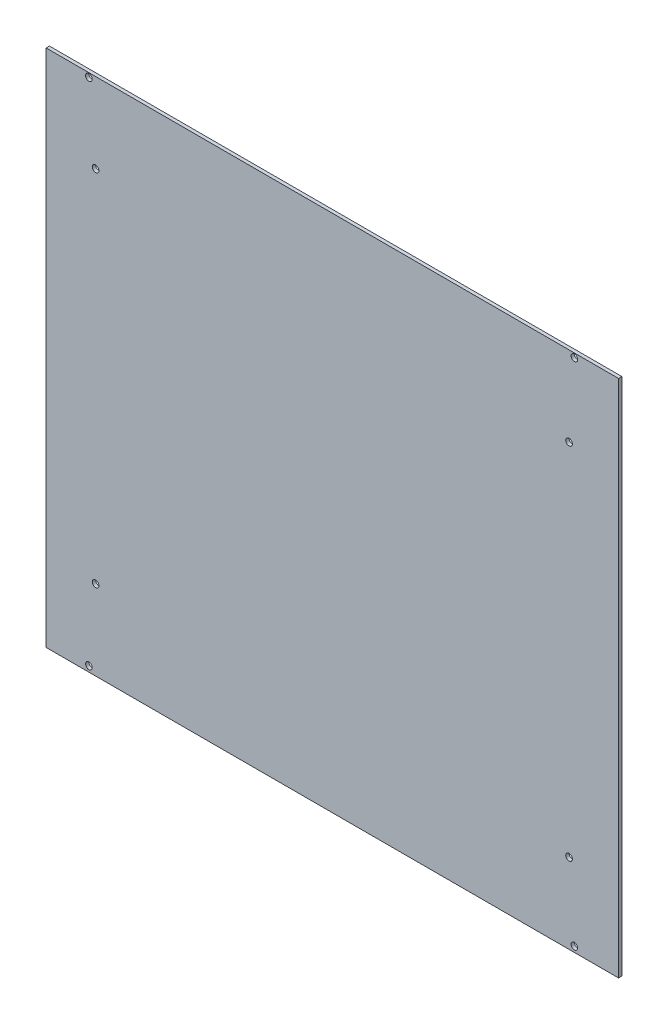
ISO-10303-21;
HEADER;
FILE_DESCRIPTION(('STEP AP214'),'2;1');
FILE_NAME('part.step','',(''),(''),'','','');
FILE_SCHEMA(('AUTOMOTIVE_DESIGN { 1 0 10303 214 1 1 1 1 }'));
ENDSEC;
DATA;
#1=APPLICATION_CONTEXT('core data for automotive mechanical design processes');
#2=APPLICATION_PROTOCOL_DEFINITION('international standard','automotive_design',2000,#1);
#3=PRODUCT_CONTEXT('',#1,'mechanical');
#4=PRODUCT('Part','Part','',(#3));
#5=PRODUCT_RELATED_PRODUCT_CATEGORY('part','',(#4));
#6=PRODUCT_DEFINITION_FORMATION('','',#4);
#7=PRODUCT_DEFINITION_CONTEXT('part definition',#1,'design');
#8=PRODUCT_DEFINITION('design','',#6,#7);
#9=PRODUCT_DEFINITION_SHAPE('','',#8);
#10=(LENGTH_UNIT() NAMED_UNIT(*) SI_UNIT(.MILLI.,.METRE.));
#11=(NAMED_UNIT(*) PLANE_ANGLE_UNIT() SI_UNIT($,.RADIAN.));
#12=(NAMED_UNIT(*) SI_UNIT($,.STERADIAN.) SOLID_ANGLE_UNIT());
#13=UNCERTAINTY_MEASURE_WITH_UNIT(LENGTH_MEASURE(1.E-05),#10,'distance_accuracy_value','');
#14=(GEOMETRIC_REPRESENTATION_CONTEXT(3) GLOBAL_UNCERTAINTY_ASSIGNED_CONTEXT((#13)) GLOBAL_UNIT_ASSIGNED_CONTEXT((#10,
#11,#12)) REPRESENTATION_CONTEXT('',''));
#15=CARTESIAN_POINT('',(0.,0.,0.));
#16=DIRECTION('',(0.,0.,1.));
#17=DIRECTION('',(1.,0.,0.));
#18=AXIS2_PLACEMENT_3D('',#15,#16,#17);
#19=CARTESIAN_POINT('',(0.,0.,3.175));
#20=DIRECTION('',(0.,0.,1.));
#21=DIRECTION('',(1.,0.,0.));
#22=AXIS2_PLACEMENT_3D('',#19,#20,#21);
#23=PLANE('',#22);
#24=CARTESIAN_POINT('',(230.894832537542,243.724649044321,3.175));
#25=DIRECTION('',(0.,0.,1.));
#26=DIRECTION('',(1.,0.,0.));
#27=AXIS2_PLACEMENT_3D('',#24,#25,#26);
#28=CIRCLE('',#27,3.175);
#29=CARTESIAN_POINT('',(234.069832537542,243.724649044321,3.175));
#30=VERTEX_POINT('',#29);
#31=EDGE_CURVE('E214',#30,#30,#28,.T.);
#32=ORIENTED_EDGE('',*,*,#31,.F.);
#33=EDGE_LOOP('',(#32));
#34=FACE_BOUND('',#33,.T.);
#35=CARTESIAN_POINT('',(-232.208873439651,-242.410608142211,3.175));
#36=DIRECTION('',(0.,0.,1.));
#37=DIRECTION('',(1.,0.,0.));
#38=AXIS2_PLACEMENT_3D('',#35,#36,#37);
#39=CIRCLE('',#38,3.175);
#40=CARTESIAN_POINT('',(-229.033873439651,-242.410608142211,3.175));
#41=VERTEX_POINT('',#40);
#42=EDGE_CURVE('E210',#41,#41,#39,.T.);
#43=ORIENTED_EDGE('',*,*,#42,.F.);
#44=EDGE_LOOP('',(#43));
#45=FACE_BOUND('',#44,.T.);
#46=CARTESIAN_POINT('',(-232.208873439651,243.724649044321,3.175));
#47=DIRECTION('',(0.,0.,1.));
#48=DIRECTION('',(1.,0.,0.));
#49=AXIS2_PLACEMENT_3D('',#46,#47,#48);
#50=CIRCLE('',#49,3.175);
#51=CARTESIAN_POINT('',(-229.033873439651,243.724649044321,3.175));
#52=VERTEX_POINT('',#51);
#53=EDGE_CURVE('E184',#52,#52,#50,.T.);
#54=ORIENTED_EDGE('',*,*,#53,.F.);
#55=EDGE_LOOP('',(#54));
#56=FACE_BOUND('',#55,.T.);
#57=CARTESIAN_POINT('',(230.894832537542,-242.410608142211,3.175));
#58=DIRECTION('',(0.,0.,1.));
#59=DIRECTION('',(1.,0.,0.));
#60=AXIS2_PLACEMENT_3D('',#57,#58,#59);
#61=CIRCLE('',#60,3.175);
#62=CARTESIAN_POINT('',(234.069832537542,-242.410608142211,3.175));
#63=VERTEX_POINT('',#62);
#64=EDGE_CURVE('E204',#63,#63,#61,.T.);
#65=ORIENTED_EDGE('',*,*,#64,.F.);
#66=EDGE_LOOP('',(#65));
#67=FACE_BOUND('',#66,.T.);
#68=CARTESIAN_POINT('',(-225.806,-171.45,3.175));
#69=DIRECTION('',(0.,0.,-1.));
#70=DIRECTION('',(-1.,0.,0.));
#71=AXIS2_PLACEMENT_3D('',#68,#69,#70);
#72=CIRCLE('',#71,3.175);
#73=CARTESIAN_POINT('',(-228.981,-171.45,3.175));
#74=VERTEX_POINT('',#73);
#75=EDGE_CURVE('E236',#74,#74,#72,.T.);
#76=ORIENTED_EDGE('',*,*,#75,.T.);
#77=EDGE_LOOP('',(#76));
#78=FACE_BOUND('',#77,.T.);
#79=CARTESIAN_POINT('',(225.806,-171.45,3.175));
#80=DIRECTION('',(0.,0.,1.));
#81=DIRECTION('',(1.,0.,0.));
#82=AXIS2_PLACEMENT_3D('',#79,#80,#81);
#83=CIRCLE('',#82,3.175);
#84=CARTESIAN_POINT('',(228.981,-171.45,3.175));
#85=VERTEX_POINT('',#84);
#86=EDGE_CURVE('E219',#85,#85,#83,.T.);
#87=ORIENTED_EDGE('',*,*,#86,.F.);
#88=EDGE_LOOP('',(#87));
#89=FACE_BOUND('',#88,.T.);
#90=CARTESIAN_POINT('',(-225.806,171.45,3.175));
#91=DIRECTION('',(0.,0.,1.));
#92=DIRECTION('',(1.,0.,0.));
#93=AXIS2_PLACEMENT_3D('',#90,#91,#92);
#94=CIRCLE('',#93,3.175);
#95=CARTESIAN_POINT('',(-222.631,171.45,3.175));
#96=VERTEX_POINT('',#95);
#97=EDGE_CURVE('E231',#96,#96,#94,.T.);
#98=ORIENTED_EDGE('',*,*,#97,.F.);
#99=EDGE_LOOP('',(#98));
#100=FACE_BOUND('',#99,.T.);
#101=DIRECTION('',(1.,0.,0.));
#102=VECTOR('',#101,1.);
#103=CARTESIAN_POINT('',(-273.05,247.65,3.175));
#104=LINE('',#103,#102);
#105=CARTESIAN_POINT('',(-273.05,247.65,3.175));
#106=VERTEX_POINT('',#105);
#107=CARTESIAN_POINT('',(273.05,247.65,3.175));
#108=VERTEX_POINT('',#107);
#109=EDGE_CURVE('E102',#106,#108,#104,.T.);
#110=ORIENTED_EDGE('',*,*,#109,.F.);
#111=DIRECTION('',(0.,1.,0.));
#112=VECTOR('',#111,1.);
#113=CARTESIAN_POINT('',(-273.05,-247.65,3.175));
#114=LINE('',#113,#112);
#115=CARTESIAN_POINT('',(-273.05,-247.65,3.175));
#116=VERTEX_POINT('',#115);
#117=EDGE_CURVE('E89',#116,#106,#114,.T.);
#118=ORIENTED_EDGE('',*,*,#117,.F.);
#119=DIRECTION('',(1.,0.,0.));
#120=VECTOR('',#119,1.);
#121=CARTESIAN_POINT('',(-273.05,-247.65,3.175));
#122=LINE('',#121,#120);
#123=CARTESIAN_POINT('',(273.05,-247.65,3.175));
#124=VERTEX_POINT('',#123);
#125=EDGE_CURVE('E86',#116,#124,#122,.T.);
#126=ORIENTED_EDGE('',*,*,#125,.T.);
#127=DIRECTION('',(0.,1.,0.));
#128=VECTOR('',#127,1.);
#129=CARTESIAN_POINT('',(273.05,-247.65,3.175));
#130=LINE('',#129,#128);
#131=EDGE_CURVE('E83',#124,#108,#130,.T.);
#132=ORIENTED_EDGE('',*,*,#131,.T.);
#133=EDGE_LOOP('',(#110,#118,#126,#132));
#134=FACE_BOUND('',#133,.T.);
#135=CARTESIAN_POINT('',(225.806,171.45,3.175));
#136=DIRECTION('',(0.,0.,-1.));
#137=DIRECTION('',(-1.,0.,0.));
#138=AXIS2_PLACEMENT_3D('',#135,#136,#137);
#139=CIRCLE('',#138,3.175);
#140=CARTESIAN_POINT('',(222.631,171.45,3.175));
#141=VERTEX_POINT('',#140);
#142=EDGE_CURVE('E227',#141,#141,#139,.T.);
#143=ORIENTED_EDGE('',*,*,#142,.T.);
#144=EDGE_LOOP('',(#143));
#145=FACE_BOUND('',#144,.T.);
#146=ADVANCED_FACE('F39',(#34,#45,#56,#67,#78,#89,#100,#134,#145),#23,.T.);
#147=CARTESIAN_POINT('',(0.,0.,0.));
#148=DIRECTION('',(0.,0.,1.));
#149=DIRECTION('',(1.,0.,0.));
#150=AXIS2_PLACEMENT_3D('',#147,#148,#149);
#151=PLANE('',#150);
#152=CARTESIAN_POINT('',(230.894832537542,243.724649044321,0.));
#153=DIRECTION('',(0.,0.,-1.));
#154=DIRECTION('',(1.,0.,0.));
#155=AXIS2_PLACEMENT_3D('',#152,#153,#154);
#156=CIRCLE('',#155,3.175);
#157=CARTESIAN_POINT('',(234.069832537542,243.724649044321,0.));
#158=VERTEX_POINT('',#157);
#159=EDGE_CURVE('E194',#158,#158,#156,.T.);
#160=ORIENTED_EDGE('',*,*,#159,.F.);
#161=EDGE_LOOP('',(#160));
#162=FACE_BOUND('',#161,.T.);
#163=CARTESIAN_POINT('',(-232.208873439651,-242.410608142211,0.));
#164=DIRECTION('',(0.,0.,-1.));
#165=DIRECTION('',(1.,0.,0.));
#166=AXIS2_PLACEMENT_3D('',#163,#164,#165);
#167=CIRCLE('',#166,3.175);
#168=CARTESIAN_POINT('',(-229.033873439651,-242.410608142211,0.));
#169=VERTEX_POINT('',#168);
#170=EDGE_CURVE('E190',#169,#169,#167,.T.);
#171=ORIENTED_EDGE('',*,*,#170,.F.);
#172=EDGE_LOOP('',(#171));
#173=FACE_BOUND('',#172,.T.);
#174=CARTESIAN_POINT('',(-232.208873439651,243.724649044321,0.));
#175=DIRECTION('',(0.,0.,-1.));
#176=DIRECTION('',(-1.,0.,0.));
#177=AXIS2_PLACEMENT_3D('',#174,#175,#176);
#178=CIRCLE('',#177,3.175);
#179=CARTESIAN_POINT('',(-235.383873439651,243.724649044321,0.));
#180=VERTEX_POINT('',#179);
#181=EDGE_CURVE('E187',#180,#180,#178,.T.);
#182=ORIENTED_EDGE('',*,*,#181,.F.);
#183=EDGE_LOOP('',(#182));
#184=FACE_BOUND('',#183,.T.);
#185=CARTESIAN_POINT('',(230.894832537542,-242.410608142211,0.));
#186=DIRECTION('',(0.,0.,-1.));
#187=DIRECTION('',(-1.,0.,0.));
#188=AXIS2_PLACEMENT_3D('',#185,#186,#187);
#189=CIRCLE('',#188,3.175);
#190=CARTESIAN_POINT('',(227.719832537542,-242.410608142211,0.));
#191=VERTEX_POINT('',#190);
#192=EDGE_CURVE('E199',#191,#191,#189,.T.);
#193=ORIENTED_EDGE('',*,*,#192,.F.);
#194=EDGE_LOOP('',(#193));
#195=FACE_BOUND('',#194,.T.);
#196=CARTESIAN_POINT('',(225.806,-171.45,0.));
#197=DIRECTION('',(0.,0.,1.));
#198=DIRECTION('',(1.,0.,0.));
#199=AXIS2_PLACEMENT_3D('',#196,#197,#198);
#200=CIRCLE('',#199,3.175);
#201=CARTESIAN_POINT('',(228.981,-171.45,0.));
#202=VERTEX_POINT('',#201);
#203=EDGE_CURVE('E218',#202,#202,#200,.T.);
#204=ORIENTED_EDGE('',*,*,#203,.T.);
#205=EDGE_LOOP('',(#204));
#206=FACE_BOUND('',#205,.T.);
#207=CARTESIAN_POINT('',(-225.806,171.45,0.));
#208=DIRECTION('',(0.,0.,1.));
#209=DIRECTION('',(1.,0.,0.));
#210=AXIS2_PLACEMENT_3D('',#207,#208,#209);
#211=CIRCLE('',#210,3.175);
#212=CARTESIAN_POINT('',(-222.631,171.45,0.));
#213=VERTEX_POINT('',#212);
#214=EDGE_CURVE('E116',#213,#213,#211,.T.);
#215=ORIENTED_EDGE('',*,*,#214,.T.);
#216=EDGE_LOOP('',(#215));
#217=FACE_BOUND('',#216,.T.);
#218=DIRECTION('',(1.,0.,0.));
#219=VECTOR('',#218,1.);
#220=CARTESIAN_POINT('',(-273.05,247.65,0.));
#221=LINE('',#220,#219);
#222=CARTESIAN_POINT('',(-273.05,247.65,0.));
#223=VERTEX_POINT('',#222);
#224=CARTESIAN_POINT('',(273.05,247.65,0.));
#225=VERTEX_POINT('',#224);
#226=EDGE_CURVE('E111',#223,#225,#221,.T.);
#227=ORIENTED_EDGE('',*,*,#226,.T.);
#228=DIRECTION('',(0.,1.,0.));
#229=VECTOR('',#228,1.);
#230=CARTESIAN_POINT('',(273.05,-247.65,0.));
#231=LINE('',#230,#229);
#232=CARTESIAN_POINT('',(273.05,-247.65,0.));
#233=VERTEX_POINT('',#232);
#234=EDGE_CURVE('E115',#233,#225,#231,.T.);
#235=ORIENTED_EDGE('',*,*,#234,.F.);
#236=DIRECTION('',(1.,0.,0.));
#237=VECTOR('',#236,1.);
#238=CARTESIAN_POINT('',(-273.05,-247.65,0.));
#239=LINE('',#238,#237);
#240=CARTESIAN_POINT('',(-273.05,-247.65,0.));
#241=VERTEX_POINT('',#240);
#242=EDGE_CURVE('E95',#241,#233,#239,.T.);
#243=ORIENTED_EDGE('',*,*,#242,.F.);
#244=DIRECTION('',(0.,1.,0.));
#245=VECTOR('',#244,1.);
#246=CARTESIAN_POINT('',(-273.05,-247.65,0.));
#247=LINE('',#246,#245);
#248=EDGE_CURVE('E105',#241,#223,#247,.T.);
#249=ORIENTED_EDGE('',*,*,#248,.T.);
#250=EDGE_LOOP('',(#227,#235,#243,#249));
#251=FACE_BOUND('',#250,.T.);
#252=CARTESIAN_POINT('',(-225.806,-171.45,0.));
#253=DIRECTION('',(0.,0.,-1.));
#254=DIRECTION('',(-1.,0.,0.));
#255=AXIS2_PLACEMENT_3D('',#252,#253,#254);
#256=CIRCLE('',#255,3.175);
#257=CARTESIAN_POINT('',(-228.981,-171.45,0.));
#258=VERTEX_POINT('',#257);
#259=EDGE_CURVE('E223',#258,#258,#256,.T.);
#260=ORIENTED_EDGE('',*,*,#259,.F.);
#261=EDGE_LOOP('',(#260));
#262=FACE_BOUND('',#261,.T.);
#263=CARTESIAN_POINT('',(225.806,171.45,0.));
#264=DIRECTION('',(0.,0.,-1.));
#265=DIRECTION('',(-1.,0.,0.));
#266=AXIS2_PLACEMENT_3D('',#263,#264,#265);
#267=CIRCLE('',#266,3.175);
#268=CARTESIAN_POINT('',(222.631,171.45,0.));
#269=VERTEX_POINT('',#268);
#270=EDGE_CURVE('E232',#269,#269,#267,.T.);
#271=ORIENTED_EDGE('',*,*,#270,.F.);
#272=EDGE_LOOP('',(#271));
#273=FACE_BOUND('',#272,.T.);
#274=ADVANCED_FACE('F127',(#162,#173,#184,#195,#206,#217,#251,#262,#273),#151,.F.);
#275=CARTESIAN_POINT('',(-273.05,247.65,3.175));
#276=DIRECTION('',(0.,1.,0.));
#277=DIRECTION('',(0.,0.,1.));
#278=AXIS2_PLACEMENT_3D('',#275,#276,#277);
#279=PLANE('',#278);
#280=ORIENTED_EDGE('',*,*,#226,.F.);
#281=DIRECTION('',(0.,0.,-1.));
#282=VECTOR('',#281,1.);
#283=CARTESIAN_POINT('',(-273.05,247.65,3.175));
#284=LINE('',#283,#282);
#285=EDGE_CURVE('E11',#106,#223,#284,.T.);
#286=ORIENTED_EDGE('',*,*,#285,.F.);
#287=ORIENTED_EDGE('',*,*,#109,.T.);
#288=DIRECTION('',(0.,0.,-1.));
#289=VECTOR('',#288,1.);
#290=CARTESIAN_POINT('',(273.05,247.65,3.175));
#291=LINE('',#290,#289);
#292=EDGE_CURVE('E43',#108,#225,#291,.T.);
#293=ORIENTED_EDGE('',*,*,#292,.T.);
#294=EDGE_LOOP('',(#280,#286,#287,#293));
#295=FACE_BOUND('',#294,.T.);
#296=ADVANCED_FACE('F41',(#295),#279,.T.);
#297=CARTESIAN_POINT('',(-273.05,-247.65,3.175));
#298=DIRECTION('',(-1.,0.,0.));
#299=DIRECTION('',(0.,0.,1.));
#300=AXIS2_PLACEMENT_3D('',#297,#298,#299);
#301=PLANE('',#300);
#302=ORIENTED_EDGE('',*,*,#248,.F.);
#303=DIRECTION('',(0.,0.,-1.));
#304=VECTOR('',#303,1.);
#305=CARTESIAN_POINT('',(-273.05,-247.65,3.175));
#306=LINE('',#305,#304);
#307=EDGE_CURVE('E50',#116,#241,#306,.T.);
#308=ORIENTED_EDGE('',*,*,#307,.F.);
#309=ORIENTED_EDGE('',*,*,#117,.T.);
#310=ORIENTED_EDGE('',*,*,#285,.T.);
#311=EDGE_LOOP('',(#302,#308,#309,#310));
#312=FACE_BOUND('',#311,.T.);
#313=ADVANCED_FACE('F129',(#312),#301,.T.);
#314=CARTESIAN_POINT('',(-273.05,-247.65,3.175));
#315=DIRECTION('',(0.,1.,0.));
#316=DIRECTION('',(0.,0.,1.));
#317=AXIS2_PLACEMENT_3D('',#314,#315,#316);
#318=PLANE('',#317);
#319=ORIENTED_EDGE('',*,*,#242,.T.);
#320=DIRECTION('',(0.,0.,-1.));
#321=VECTOR('',#320,1.);
#322=CARTESIAN_POINT('',(273.05,-247.65,3.175));
#323=LINE('',#322,#321);
#324=EDGE_CURVE('E93',#124,#233,#323,.T.);
#325=ORIENTED_EDGE('',*,*,#324,.F.);
#326=ORIENTED_EDGE('',*,*,#125,.F.);
#327=ORIENTED_EDGE('',*,*,#307,.T.);
#328=EDGE_LOOP('',(#319,#325,#326,#327));
#329=FACE_BOUND('',#328,.T.);
#330=ADVANCED_FACE('F94',(#329),#318,.F.);
#331=CARTESIAN_POINT('',(273.05,-247.65,3.175));
#332=DIRECTION('',(-1.,0.,0.));
#333=DIRECTION('',(0.,0.,1.));
#334=AXIS2_PLACEMENT_3D('',#331,#332,#333);
#335=PLANE('',#334);
#336=ORIENTED_EDGE('',*,*,#234,.T.);
#337=ORIENTED_EDGE('',*,*,#292,.F.);
#338=ORIENTED_EDGE('',*,*,#131,.F.);
#339=ORIENTED_EDGE('',*,*,#324,.T.);
#340=EDGE_LOOP('',(#336,#337,#338,#339));
#341=FACE_BOUND('',#340,.T.);
#342=ADVANCED_FACE('F100',(#341),#335,.F.);
#343=CARTESIAN_POINT('',(-225.806,171.45,0.));
#344=DIRECTION('',(0.,0.,1.));
#345=DIRECTION('',(1.,0.,0.));
#346=AXIS2_PLACEMENT_3D('',#343,#344,#345);
#347=CYLINDRICAL_SURFACE('',#346,3.175);
#348=ORIENTED_EDGE('',*,*,#214,.F.);
#349=EDGE_LOOP('',(#348));
#350=FACE_BOUND('',#349,.T.);
#351=ORIENTED_EDGE('',*,*,#97,.T.);
#352=EDGE_LOOP('',(#351));
#353=FACE_BOUND('',#352,.T.);
#354=ADVANCED_FACE('F148',(#350,#353),#347,.F.);
#355=CARTESIAN_POINT('',(225.806,-171.45,0.));
#356=DIRECTION('',(0.,0.,1.));
#357=DIRECTION('',(1.,0.,0.));
#358=AXIS2_PLACEMENT_3D('',#355,#356,#357);
#359=CYLINDRICAL_SURFACE('',#358,3.175);
#360=ORIENTED_EDGE('',*,*,#203,.F.);
#361=EDGE_LOOP('',(#360));
#362=FACE_BOUND('',#361,.T.);
#363=ORIENTED_EDGE('',*,*,#86,.T.);
#364=EDGE_LOOP('',(#363));
#365=FACE_BOUND('',#364,.T.);
#366=ADVANCED_FACE('F151',(#362,#365),#359,.F.);
#367=CARTESIAN_POINT('',(-225.806,-171.45,0.));
#368=DIRECTION('',(0.,0.,1.));
#369=DIRECTION('',(1.,0.,0.));
#370=AXIS2_PLACEMENT_3D('',#367,#368,#369);
#371=CYLINDRICAL_SURFACE('',#370,3.175);
#372=ORIENTED_EDGE('',*,*,#259,.T.);
#373=EDGE_LOOP('',(#372));
#374=FACE_BOUND('',#373,.T.);
#375=ORIENTED_EDGE('',*,*,#75,.F.);
#376=EDGE_LOOP('',(#375));
#377=FACE_BOUND('',#376,.T.);
#378=ADVANCED_FACE('F153',(#374,#377),#371,.F.);
#379=CARTESIAN_POINT('',(225.806,171.45,0.));
#380=DIRECTION('',(0.,0.,1.));
#381=DIRECTION('',(1.,0.,0.));
#382=AXIS2_PLACEMENT_3D('',#379,#380,#381);
#383=CYLINDRICAL_SURFACE('',#382,3.175);
#384=ORIENTED_EDGE('',*,*,#270,.T.);
#385=EDGE_LOOP('',(#384));
#386=FACE_BOUND('',#385,.T.);
#387=ORIENTED_EDGE('',*,*,#142,.F.);
#388=EDGE_LOOP('',(#387));
#389=FACE_BOUND('',#388,.T.);
#390=ADVANCED_FACE('F156',(#386,#389),#383,.F.);
#391=CARTESIAN_POINT('',(230.894832537542,-242.410608142211,6.35));
#392=DIRECTION('',(0.,0.,-1.));
#393=DIRECTION('',(-1.,0.,0.));
#394=AXIS2_PLACEMENT_3D('',#391,#392,#393);
#395=CYLINDRICAL_SURFACE('',#394,3.175);
#396=ORIENTED_EDGE('',*,*,#64,.T.);
#397=EDGE_LOOP('',(#396));
#398=FACE_BOUND('',#397,.T.);
#399=ORIENTED_EDGE('',*,*,#192,.T.);
#400=EDGE_LOOP('',(#399));
#401=FACE_BOUND('',#400,.T.);
#402=ADVANCED_FACE('F160',(#398,#401),#395,.F.);
#403=CARTESIAN_POINT('',(-232.208873439651,243.724649044321,6.35));
#404=DIRECTION('',(0.,0.,-1.));
#405=DIRECTION('',(-1.,0.,0.));
#406=AXIS2_PLACEMENT_3D('',#403,#404,#405);
#407=CYLINDRICAL_SURFACE('',#406,3.175);
#408=ORIENTED_EDGE('',*,*,#53,.T.);
#409=EDGE_LOOP('',(#408));
#410=FACE_BOUND('',#409,.T.);
#411=ORIENTED_EDGE('',*,*,#181,.T.);
#412=EDGE_LOOP('',(#411));
#413=FACE_BOUND('',#412,.T.);
#414=ADVANCED_FACE('F167',(#410,#413),#407,.F.);
#415=CARTESIAN_POINT('',(-232.208873439651,-242.410608142211,6.35));
#416=DIRECTION('',(0.,0.,-1.));
#417=DIRECTION('',(-1.,0.,0.));
#418=AXIS2_PLACEMENT_3D('',#415,#416,#417);
#419=CYLINDRICAL_SURFACE('',#418,3.175);
#420=ORIENTED_EDGE('',*,*,#42,.T.);
#421=EDGE_LOOP('',(#420));
#422=FACE_BOUND('',#421,.T.);
#423=ORIENTED_EDGE('',*,*,#170,.T.);
#424=EDGE_LOOP('',(#423));
#425=FACE_BOUND('',#424,.T.);
#426=ADVANCED_FACE('F169',(#422,#425),#419,.F.);
#427=CARTESIAN_POINT('',(230.894832537542,243.724649044321,6.35));
#428=DIRECTION('',(0.,0.,-1.));
#429=DIRECTION('',(-1.,0.,0.));
#430=AXIS2_PLACEMENT_3D('',#427,#428,#429);
#431=CYLINDRICAL_SURFACE('',#430,3.175);
#432=ORIENTED_EDGE('',*,*,#31,.T.);
#433=EDGE_LOOP('',(#432));
#434=FACE_BOUND('',#433,.T.);
#435=ORIENTED_EDGE('',*,*,#159,.T.);
#436=EDGE_LOOP('',(#435));
#437=FACE_BOUND('',#436,.T.);
#438=ADVANCED_FACE('F172',(#434,#437),#431,.F.);
#439=CLOSED_SHELL('',(#146,#274,#296,#313,#330,#342,#354,#366,#378,#390,#402,#414,#426,#438));
#440=MANIFOLD_SOLID_BREP('B2',#439);
#441=ADVANCED_BREP_SHAPE_REPRESENTATION('',(#18,#440),#14);
#442=SHAPE_DEFINITION_REPRESENTATION(#9,#441);
ENDSEC;
END-ISO-10303-21;
